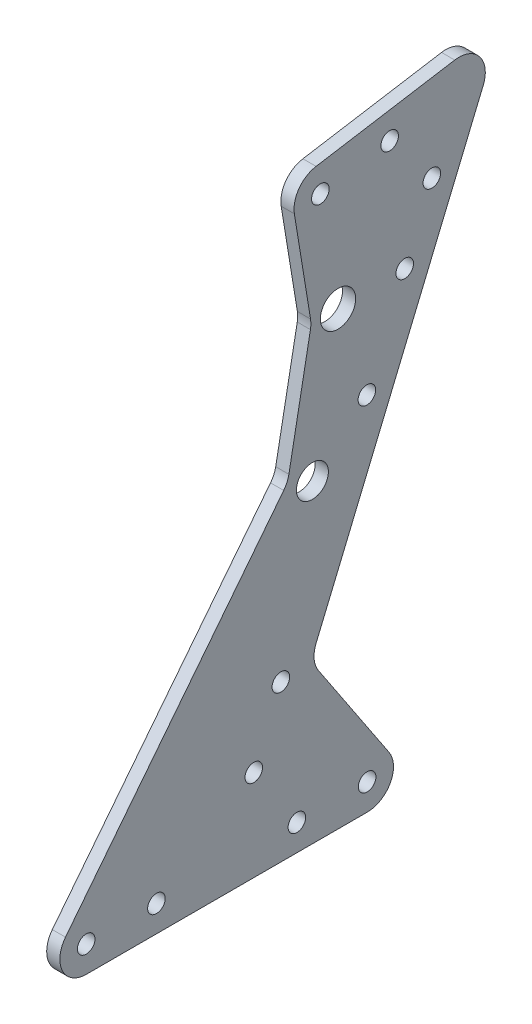
ISO-10303-21;
HEADER;
FILE_DESCRIPTION(('STEP AP214'),'2;1');
FILE_NAME('part.step','',(''),(''),'','','');
FILE_SCHEMA(('AUTOMOTIVE_DESIGN { 1 0 10303 214 1 1 1 1 }'));
ENDSEC;
DATA;
#1=APPLICATION_CONTEXT('core data for automotive mechanical design processes');
#2=APPLICATION_PROTOCOL_DEFINITION('international standard','automotive_design',2000,#1);
#3=PRODUCT_CONTEXT('',#1,'mechanical');
#4=PRODUCT('Part','Part','',(#3));
#5=PRODUCT_RELATED_PRODUCT_CATEGORY('part','',(#4));
#6=PRODUCT_DEFINITION_FORMATION('','',#4);
#7=PRODUCT_DEFINITION_CONTEXT('part definition',#1,'design');
#8=PRODUCT_DEFINITION('design','',#6,#7);
#9=PRODUCT_DEFINITION_SHAPE('','',#8);
#10=(LENGTH_UNIT() NAMED_UNIT(*) SI_UNIT(.MILLI.,.METRE.));
#11=(NAMED_UNIT(*) PLANE_ANGLE_UNIT() SI_UNIT($,.RADIAN.));
#12=(NAMED_UNIT(*) SI_UNIT($,.STERADIAN.) SOLID_ANGLE_UNIT());
#13=UNCERTAINTY_MEASURE_WITH_UNIT(LENGTH_MEASURE(1.E-05),#10,'distance_accuracy_value','');
#14=(GEOMETRIC_REPRESENTATION_CONTEXT(3) GLOBAL_UNCERTAINTY_ASSIGNED_CONTEXT((#13)) GLOBAL_UNIT_ASSIGNED_CONTEXT((#10,
#11,#12)) REPRESENTATION_CONTEXT('',''));
#15=CARTESIAN_POINT('',(0.,0.,0.));
#16=DIRECTION('',(0.,0.,1.));
#17=DIRECTION('',(1.,0.,0.));
#18=AXIS2_PLACEMENT_3D('',#15,#16,#17);
#19=CARTESIAN_POINT('',(17.2911124839999,-177.260133620989,1087.00573800224));
#20=DIRECTION('',(0.,-0.16094600503696,0.986963212821351));
#21=DIRECTION('',(0.,-0.986963212821351,-0.16094600503696));
#22=AXIS2_PLACEMENT_3D('',#19,#20,#21);
#23=PLANE('',#22);
#24=DIRECTION('',(0.,0.986963212821351,0.16094600503696));
#25=VECTOR('',#24,1.);
#26=CARTESIAN_POINT('',(12.5286124839999,-177.260133620989,1087.00573800224));
#27=LINE('',#26,#25);
#28=CARTESIAN_POINT('',(12.5286124839999,300.073552702172,1164.84546787795));
#29=VERTEX_POINT('',#28);
#30=CARTESIAN_POINT('',(12.5286124839999,335.947293432134,1170.69546834526));
#31=VERTEX_POINT('',#30);
#32=EDGE_CURVE('E229',#29,#31,#27,.T.);
#33=ORIENTED_EDGE('',*,*,#32,.F.);
#34=DIRECTION('',(-1.,0.,0.));
#35=VECTOR('',#34,1.);
#36=CARTESIAN_POINT('',(17.2911124839999,300.073552702172,1164.84546787795));
#37=LINE('',#36,#35);
#38=CARTESIAN_POINT('',(17.2911124839999,300.073552702172,1164.84546787795));
#39=VERTEX_POINT('',#38);
#40=EDGE_CURVE('E316',#29,#39,#37,.F.);
#41=ORIENTED_EDGE('',*,*,#40,.T.);
#42=DIRECTION('',(0.,0.986963212821351,0.16094600503696));
#43=VECTOR('',#42,1.);
#44=CARTESIAN_POINT('',(17.2911124839999,-177.260133620989,1087.00573800224));
#45=LINE('',#44,#43);
#46=CARTESIAN_POINT('',(17.2911124839999,335.947293432134,1170.69546834526));
#47=VERTEX_POINT('',#46);
#48=EDGE_CURVE('E172',#39,#47,#45,.T.);
#49=ORIENTED_EDGE('',*,*,#48,.T.);
#50=DIRECTION('',(-1.,0.,0.));
#51=VECTOR('',#50,1.);
#52=CARTESIAN_POINT('',(17.2911124839999,335.947293432134,1170.69546834526));
#53=LINE('',#52,#51);
#54=EDGE_CURVE('E228',#47,#31,#53,.T.);
#55=ORIENTED_EDGE('',*,*,#54,.T.);
#56=EDGE_LOOP('',(#33,#41,#49,#55));
#57=FACE_BOUND('',#56,.T.);
#58=ADVANCED_FACE('F41',(#57),#23,.T.);
#59=CARTESIAN_POINT('',(17.2911124839999,221.756612247857,1178.99650572783));
#60=DIRECTION('',(0.,-0.184847968546176,-0.982767128329164));
#61=DIRECTION('',(0.,0.982767128329164,-0.184847968546176));
#62=AXIS2_PLACEMENT_3D('',#59,#60,#61);
#63=PLANE('',#62);
#64=DIRECTION('',(0.,-0.982767128329164,0.184847968546176));
#65=VECTOR('',#64,1.);
#66=CARTESIAN_POINT('',(12.5286124839999,221.756612247857,1178.99650572783));
#67=LINE('',#66,#65);
#68=CARTESIAN_POINT('',(12.5286124839999,296.779865103792,1164.88543558274));
#69=VERTEX_POINT('',#68);
#70=CARTESIAN_POINT('',(12.5286124839999,255.363662032225,1172.67537969258));
#71=VERTEX_POINT('',#70);
#72=EDGE_CURVE('E231',#69,#71,#67,.T.);
#73=ORIENTED_EDGE('',*,*,#72,.T.);
#74=DIRECTION('',(-1.,0.,0.));
#75=VECTOR('',#74,1.);
#76=CARTESIAN_POINT('',(17.2911124839999,255.363662032225,1172.67537969258));
#77=LINE('',#76,#75);
#78=CARTESIAN_POINT('',(17.2911124839999,255.363662032225,1172.67537969258));
#79=VERTEX_POINT('',#78);
#80=EDGE_CURVE('E314',#71,#79,#77,.F.);
#81=ORIENTED_EDGE('',*,*,#80,.T.);
#82=DIRECTION('',(0.,-0.982767128329164,0.184847968546176));
#83=VECTOR('',#82,1.);
#84=CARTESIAN_POINT('',(17.2911124839999,221.756612247857,1178.99650572783));
#85=LINE('',#84,#83);
#86=CARTESIAN_POINT('',(17.2911124839999,296.779865103792,1164.88543558274));
#87=VERTEX_POINT('',#86);
#88=EDGE_CURVE('E170',#87,#79,#85,.T.);
#89=ORIENTED_EDGE('',*,*,#88,.F.);
#90=DIRECTION('',(-1.,0.,0.));
#91=VECTOR('',#90,1.);
#92=CARTESIAN_POINT('',(17.2911124839999,296.779865103792,1164.88543558274));
#93=LINE('',#92,#91);
#94=EDGE_CURVE('E311',#87,#69,#93,.T.);
#95=ORIENTED_EDGE('',*,*,#94,.T.);
#96=EDGE_LOOP('',(#73,#81,#89,#95));
#97=FACE_BOUND('',#96,.T.);
#98=ADVANCED_FACE('F344',(#97),#63,.F.);
#99=CARTESIAN_POINT('',(17.2911124839999,666.473775740038,848.323474721654));
#100=DIRECTION('',(0.,0.617783669154316,0.786348102386106));
#101=DIRECTION('',(0.,-0.786348102386106,0.617783669154316));
#102=AXIS2_PLACEMENT_3D('',#99,#100,#101);
#103=PLANE('',#102);
#104=DIRECTION('',(0.,0.786348102386106,-0.617783669154316));
#105=VECTOR('',#104,1.);
#106=CARTESIAN_POINT('',(17.2911124839999,666.473775740038,848.323474721654));
#107=LINE('',#106,#105);
#108=CARTESIAN_POINT('',(17.2911124839999,150.788964002695,1253.46421856721));
#109=VERTEX_POINT('',#108);
#110=CARTESIAN_POINT('',(17.2911124839999,251.239949483933,1174.54627091469));
#111=VERTEX_POINT('',#110);
#112=EDGE_CURVE('E149',#109,#111,#107,.T.);
#113=ORIENTED_EDGE('',*,*,#112,.T.);
#114=DIRECTION('',(-1.,0.,0.));
#115=VECTOR('',#114,1.);
#116=CARTESIAN_POINT('',(17.2911124839999,251.239949483932,1174.54627091469));
#117=LINE('',#116,#115);
#118=CARTESIAN_POINT('',(12.5286124839999,251.239949483933,1174.54627091469));
#119=VERTEX_POINT('',#118);
#120=EDGE_CURVE('E309',#111,#119,#117,.T.);
#121=ORIENTED_EDGE('',*,*,#120,.T.);
#122=DIRECTION('',(0.,0.786348102386106,-0.617783669154316));
#123=VECTOR('',#122,1.);
#124=CARTESIAN_POINT('',(12.5286124839999,666.473775740038,848.323474721654));
#125=LINE('',#124,#123);
#126=CARTESIAN_POINT('',(12.5286124839999,150.788964002695,1253.46421856721));
#127=VERTEX_POINT('',#126);
#128=EDGE_CURVE('E152',#127,#119,#125,.T.);
#129=ORIENTED_EDGE('',*,*,#128,.F.);
#130=DIRECTION('',(-1.,0.,0.));
#131=VECTOR('',#130,1.);
#132=CARTESIAN_POINT('',(17.2911124839999,150.788964002695,1253.46421856721));
#133=LINE('',#132,#131);
#134=EDGE_CURVE('E144',#109,#127,#133,.T.);
#135=ORIENTED_EDGE('',*,*,#134,.F.);
#136=EDGE_LOOP('',(#113,#121,#129,#135));
#137=FACE_BOUND('',#136,.T.);
#138=ADVANCED_FACE('F146',(#137),#103,.T.);
#139=CARTESIAN_POINT('',(17.2911124839999,144.904574554,1245.97425289198));
#140=DIRECTION('',(-1.,0.,0.));
#141=DIRECTION('',(0.,0.,1.));
#142=AXIS2_PLACEMENT_3D('',#139,#140,#141);
#143=CYLINDRICAL_SURFACE('',#142,9.52499999999998);
#144=CARTESIAN_POINT('',(12.5286124839999,144.904574554,1245.97425289198));
#145=DIRECTION('',(1.,0.,0.));
#146=DIRECTION('',(0.,0.,-1.));
#147=AXIS2_PLACEMENT_3D('',#144,#145,#146);
#148=CIRCLE('',#147,9.52499999999998);
#149=CARTESIAN_POINT('',(12.5286124839999,135.379574554,1245.97425289198));
#150=VERTEX_POINT('',#149);
#151=EDGE_CURVE('E235',#127,#150,#148,.T.);
#152=ORIENTED_EDGE('',*,*,#151,.T.);
#153=DIRECTION('',(-1.,0.,0.));
#154=VECTOR('',#153,1.);
#155=CARTESIAN_POINT('',(17.2911124839999,135.379574554,1245.97425289198));
#156=LINE('',#155,#154);
#157=CARTESIAN_POINT('',(17.2911124839999,135.379574554,1245.97425289198));
#158=VERTEX_POINT('',#157);
#159=EDGE_CURVE('E156',#158,#150,#156,.T.);
#160=ORIENTED_EDGE('',*,*,#159,.F.);
#161=CARTESIAN_POINT('',(17.2911124839999,144.904574554,1245.97425289198));
#162=DIRECTION('',(1.,0.,0.));
#163=DIRECTION('',(0.,0.,-1.));
#164=AXIS2_PLACEMENT_3D('',#161,#162,#163);
#165=CIRCLE('',#164,9.52499999999998);
#166=EDGE_CURVE('E159',#109,#158,#165,.T.);
#167=ORIENTED_EDGE('',*,*,#166,.F.);
#168=ORIENTED_EDGE('',*,*,#134,.T.);
#169=EDGE_LOOP('',(#152,#160,#167,#168));
#170=FACE_BOUND('',#169,.T.);
#171=ADVANCED_FACE('F160',(#170),#143,.T.);
#172=CARTESIAN_POINT('',(17.2911124839999,135.379574554001,0.));
#173=DIRECTION('',(0.,1.,0.));
#174=DIRECTION('',(0.,0.,1.));
#175=AXIS2_PLACEMENT_3D('',#172,#173,#174);
#176=PLANE('',#175);
#177=DIRECTION('',(0.,0.,-1.));
#178=VECTOR('',#177,1.);
#179=CARTESIAN_POINT('',(12.5286124839999,135.379574554001,0.));
#180=LINE('',#179,#178);
#181=CARTESIAN_POINT('',(12.5286124839999,135.379574554,1144.37425289198));
#182=VERTEX_POINT('',#181);
#183=EDGE_CURVE('E237',#150,#182,#180,.T.);
#184=ORIENTED_EDGE('',*,*,#183,.T.);
#185=DIRECTION('',(-1.,0.,0.));
#186=VECTOR('',#185,1.);
#187=CARTESIAN_POINT('',(17.2911124839999,135.379574554,1144.37425289198));
#188=LINE('',#187,#186);
#189=CARTESIAN_POINT('',(17.2911124839999,135.379574554,1144.37425289198));
#190=VERTEX_POINT('',#189);
#191=EDGE_CURVE('E299',#190,#182,#188,.T.);
#192=ORIENTED_EDGE('',*,*,#191,.F.);
#193=DIRECTION('',(0.,0.,-1.));
#194=VECTOR('',#193,1.);
#195=CARTESIAN_POINT('',(17.2911124839999,135.379574554001,0.));
#196=LINE('',#195,#194);
#197=EDGE_CURVE('E163',#158,#190,#196,.T.);
#198=ORIENTED_EDGE('',*,*,#197,.F.);
#199=ORIENTED_EDGE('',*,*,#159,.T.);
#200=EDGE_LOOP('',(#184,#192,#198,#199));
#201=FACE_BOUND('',#200,.T.);
#202=ADVANCED_FACE('F351',(#201),#176,.F.);
#203=CARTESIAN_POINT('',(17.2911124839999,144.904574554,1144.37425289198));
#204=DIRECTION('',(-1.,0.,0.));
#205=DIRECTION('',(0.,0.,1.));
#206=AXIS2_PLACEMENT_3D('',#203,#204,#205);
#207=CYLINDRICAL_SURFACE('',#206,9.52500000000001);
#208=CARTESIAN_POINT('',(12.5286124839999,144.904574554,1144.37425289198));
#209=DIRECTION('',(1.,0.,0.));
#210=DIRECTION('',(0.,0.,-1.));
#211=AXIS2_PLACEMENT_3D('',#208,#209,#210);
#212=CIRCLE('',#211,9.52500000000001);
#213=CARTESIAN_POINT('',(12.5286124839999,150.182469724752,1136.44522725408));
#214=VERTEX_POINT('',#213);
#215=EDGE_CURVE('E239',#182,#214,#212,.T.);
#216=ORIENTED_EDGE('',*,*,#215,.T.);
#217=DIRECTION('',(-1.,0.,0.));
#218=VECTOR('',#217,1.);
#219=CARTESIAN_POINT('',(17.2911124839999,150.182469724752,1136.44522725408));
#220=LINE('',#219,#218);
#221=CARTESIAN_POINT('',(17.2911124839999,150.182469724752,1136.44522725408));
#222=VERTEX_POINT('',#221);
#223=EDGE_CURVE('E296',#222,#214,#220,.T.);
#224=ORIENTED_EDGE('',*,*,#223,.F.);
#225=CARTESIAN_POINT('',(17.2911124839999,144.904574554,1144.37425289198));
#226=DIRECTION('',(1.,0.,0.));
#227=DIRECTION('',(0.,0.,-1.));
#228=AXIS2_PLACEMENT_3D('',#225,#226,#227);
#229=CIRCLE('',#228,9.52500000000001);
#230=EDGE_CURVE('E177',#190,#222,#229,.T.);
#231=ORIENTED_EDGE('',*,*,#230,.F.);
#232=ORIENTED_EDGE('',*,*,#191,.T.);
#233=EDGE_LOOP('',(#216,#224,#231,#232));
#234=FACE_BOUND('',#233,.T.);
#235=ADVANCED_FACE('F358',(#234),#207,.T.);
#236=CARTESIAN_POINT('',(17.2911124839999,-478.090878006488,718.239886606647));
#237=DIRECTION('',(0.,-0.554109729212728,0.832443636525499));
#238=DIRECTION('',(0.,-0.832443636525499,-0.554109729212728));
#239=AXIS2_PLACEMENT_3D('',#236,#237,#238);
#240=PLANE('',#239);
#241=DIRECTION('',(0.,0.832443636525499,0.554109729212728));
#242=VECTOR('',#241,1.);
#243=CARTESIAN_POINT('',(12.5286124839999,-478.090878006488,718.239886606647));
#244=LINE('',#243,#242);
#245=CARTESIAN_POINT('',(12.5286124839999,188.552796057086,1161.98614101799));
#246=VERTEX_POINT('',#245);
#247=EDGE_CURVE('E241',#214,#246,#244,.T.);
#248=ORIENTED_EDGE('',*,*,#247,.T.);
#249=DIRECTION('',(-1.,0.,0.));
#250=VECTOR('',#249,1.);
#251=CARTESIAN_POINT('',(17.2911124839999,188.552796057086,1161.98614101799));
#252=LINE('',#251,#250);
#253=CARTESIAN_POINT('',(17.2911124839999,188.552796057086,1161.98614101799));
#254=VERTEX_POINT('',#253);
#255=EDGE_CURVE('E307',#246,#254,#252,.F.);
#256=ORIENTED_EDGE('',*,*,#255,.T.);
#257=DIRECTION('',(0.,0.832443636525499,0.554109729212728));
#258=VECTOR('',#257,1.);
#259=CARTESIAN_POINT('',(17.2911124839999,-478.090878006488,718.239886606647));
#260=LINE('',#259,#258);
#261=EDGE_CURVE('E179',#222,#254,#260,.T.);
#262=ORIENTED_EDGE('',*,*,#261,.F.);
#263=ORIENTED_EDGE('',*,*,#223,.T.);
#264=EDGE_LOOP('',(#248,#256,#262,#263));
#265=FACE_BOUND('',#264,.T.);
#266=ADVANCED_FACE('F361',(#265),#240,.F.);
#267=CARTESIAN_POINT('',(17.2911124839999,443.420534507392,1059.97031914496));
#268=DIRECTION('',(0.,0.385924815983594,0.922530236040006));
#269=DIRECTION('',(0.,-0.922530236040006,0.385924815983594));
#270=AXIS2_PLACEMENT_3D('',#267,#268,#269);
#271=PLANE('',#270);
#272=DIRECTION('',(0.,0.922530236040006,-0.385924815983594));
#273=VECTOR('',#272,1.);
#274=CARTESIAN_POINT('',(17.2911124839999,443.420534507392,1059.97031914496));
#275=LINE('',#274,#273);
#276=CARTESIAN_POINT('',(17.2911124839999,197.506625100081,1162.84421587836));
#277=VERTEX_POINT('',#276);
#278=CARTESIAN_POINT('',(17.2911124839999,342.042705737599,1102.38000761299));
#279=VERTEX_POINT('',#278);
#280=EDGE_CURVE('E182',#277,#279,#275,.T.);
#281=ORIENTED_EDGE('',*,*,#280,.F.);
#282=DIRECTION('',(-1.,0.,0.));
#283=VECTOR('',#282,1.);
#284=CARTESIAN_POINT('',(12.5286124839999,197.506625100081,1162.84421587836));
#285=LINE('',#284,#283);
#286=CARTESIAN_POINT('',(12.5286124839999,197.506625100081,1162.84421587836));
#287=VERTEX_POINT('',#286);
#288=EDGE_CURVE('E304',#277,#287,#285,.T.);
#289=ORIENTED_EDGE('',*,*,#288,.T.);
#290=DIRECTION('',(0.,0.922530236040006,-0.385924815983594));
#291=VECTOR('',#290,1.);
#292=CARTESIAN_POINT('',(12.5286124839999,443.420534507392,1059.97031914496));
#293=LINE('',#292,#291);
#294=CARTESIAN_POINT('',(12.5286124839999,342.042705737599,1102.38000761299));
#295=VERTEX_POINT('',#294);
#296=EDGE_CURVE('E244',#287,#295,#293,.T.);
#297=ORIENTED_EDGE('',*,*,#296,.T.);
#298=DIRECTION('',(-1.,0.,0.));
#299=VECTOR('',#298,1.);
#300=CARTESIAN_POINT('',(17.2911124839999,342.042705737599,1102.38000761299));
#301=LINE('',#300,#299);
#302=EDGE_CURVE('E155',#295,#279,#301,.F.);
#303=ORIENTED_EDGE('',*,*,#302,.T.);
#304=EDGE_LOOP('',(#281,#289,#297,#303));
#305=FACE_BOUND('',#304,.T.);
#306=ADVANCED_FACE('F368',(#305),#271,.F.);
#307=CARTESIAN_POINT('',(17.2911124839999,523.83998949641,86.0917959914146));
#308=DIRECTION('',(0.,0.986762512438189,0.162171958262431));
#309=DIRECTION('',(0.,-0.162171958262431,0.98676251243819));
#310=AXIS2_PLACEMENT_3D('',#307,#308,#309);
#311=PLANE('',#310);
#312=DIRECTION('',(0.,0.162171958262432,-0.98676251243819));
#313=VECTOR('',#312,1.);
#314=CARTESIAN_POINT('',(17.2911124839999,523.83998949641,86.0917959914146));
#315=LINE('',#314,#313);
#316=CARTESIAN_POINT('',(17.2911124839999,346.879217061085,1162.83933164558));
#317=VERTEX_POINT('',#316);
#318=CARTESIAN_POINT('',(17.2911124839999,355.117552540817,1112.71179601372));
#319=VERTEX_POINT('',#318);
#320=EDGE_CURVE('E184',#317,#319,#315,.T.);
#321=ORIENTED_EDGE('',*,*,#320,.T.);
#322=DIRECTION('',(-1.,0.,0.));
#323=VECTOR('',#322,1.);
#324=CARTESIAN_POINT('',(12.5286124839999,355.117552540817,1112.71179601372));
#325=LINE('',#324,#323);
#326=CARTESIAN_POINT('',(12.5286124839999,355.117552540817,1112.71179601372));
#327=VERTEX_POINT('',#326);
#328=EDGE_CURVE('E318',#319,#327,#325,.T.);
#329=ORIENTED_EDGE('',*,*,#328,.T.);
#330=DIRECTION('',(0.,0.162171958262432,-0.98676251243819));
#331=VECTOR('',#330,1.);
#332=CARTESIAN_POINT('',(12.5286124839999,523.83998949641,86.0917959914146));
#333=LINE('',#332,#331);
#334=CARTESIAN_POINT('',(12.5286124839999,346.879217061085,1162.83933164558));
#335=VERTEX_POINT('',#334);
#336=EDGE_CURVE('E247',#335,#327,#333,.T.);
#337=ORIENTED_EDGE('',*,*,#336,.F.);
#338=DIRECTION('',(-1.,0.,0.));
#339=VECTOR('',#338,1.);
#340=CARTESIAN_POINT('',(17.2911124839999,346.879217061085,1162.83933164558));
#341=LINE('',#340,#339);
#342=EDGE_CURVE('E294',#317,#335,#341,.T.);
#343=ORIENTED_EDGE('',*,*,#342,.F.);
#344=EDGE_LOOP('',(#321,#329,#337,#343));
#345=FACE_BOUND('',#344,.T.);
#346=ADVANCED_FACE('F372',(#345),#311,.T.);
#347=CARTESIAN_POINT('',(17.2911124839999,298.305859312676,1154.90639105955));
#348=DIRECTION('',(-1.,0.,0.));
#349=DIRECTION('',(0.,0.,1.));
#350=AXIS2_PLACEMENT_3D('',#347,#348,#349);
#351=CYLINDRICAL_SURFACE('',#350,6.38209851418466);
#352=CARTESIAN_POINT('',(17.2911124839999,298.305859312676,1154.90639105955));
#353=DIRECTION('',(1.,0.,0.));
#354=DIRECTION('',(0.,0.,-1.));
#355=AXIS2_PLACEMENT_3D('',#352,#353,#354);
#356=CIRCLE('',#355,6.38209851418466);
#357=CARTESIAN_POINT('',(17.2911124839999,298.305859312676,1148.52429254536));
#358=VERTEX_POINT('',#357);
#359=EDGE_CURVE('E222',#358,#358,#356,.T.);
#360=ORIENTED_EDGE('',*,*,#359,.T.);
#361=EDGE_LOOP('',(#360));
#362=FACE_BOUND('',#361,.T.);
#363=CARTESIAN_POINT('',(12.5286124839999,298.305859312676,1154.90639105955));
#364=DIRECTION('',(1.,0.,0.));
#365=DIRECTION('',(0.,0.,-1.));
#366=AXIS2_PLACEMENT_3D('',#363,#364,#365);
#367=CIRCLE('',#366,6.38209851418466);
#368=CARTESIAN_POINT('',(12.5286124839999,298.305859312676,1148.52429254536));
#369=VERTEX_POINT('',#368);
#370=EDGE_CURVE('E286',#369,#369,#367,.T.);
#371=ORIENTED_EDGE('',*,*,#370,.F.);
#372=EDGE_LOOP('',(#371));
#373=FACE_BOUND('',#372,.T.);
#374=ADVANCED_FACE('F556',(#362,#373),#351,.F.);
#375=CARTESIAN_POINT('',(17.2911124839999,322.286371614427,1120.96959843726));
#376=DIRECTION('',(-1.,0.,0.));
#377=DIRECTION('',(0.,0.,1.));
#378=AXIS2_PLACEMENT_3D('',#375,#376,#377);
#379=CYLINDRICAL_SURFACE('',#378,3.17500000000009);
#380=CARTESIAN_POINT('',(17.2911124839999,322.286371614427,1120.96959843726));
#381=DIRECTION('',(1.,0.,0.));
#382=DIRECTION('',(0.,0.,-1.));
#383=AXIS2_PLACEMENT_3D('',#380,#381,#382);
#384=CIRCLE('',#383,3.17500000000009);
#385=CARTESIAN_POINT('',(17.2911124839999,322.286371614427,1117.79459843726));
#386=VERTEX_POINT('',#385);
#387=EDGE_CURVE('E219',#386,#386,#384,.T.);
#388=ORIENTED_EDGE('',*,*,#387,.T.);
#389=EDGE_LOOP('',(#388));
#390=FACE_BOUND('',#389,.T.);
#391=CARTESIAN_POINT('',(12.5286124839999,322.286371614427,1120.96959843726));
#392=DIRECTION('',(1.,0.,0.));
#393=DIRECTION('',(0.,0.,-1.));
#394=AXIS2_PLACEMENT_3D('',#391,#392,#393);
#395=CIRCLE('',#394,3.17500000000009);
#396=CARTESIAN_POINT('',(12.5286124839999,322.286371614427,1117.79459843726));
#397=VERTEX_POINT('',#396);
#398=EDGE_CURVE('E283',#397,#397,#395,.T.);
#399=ORIENTED_EDGE('',*,*,#398,.F.);
#400=EDGE_LOOP('',(#399));
#401=FACE_BOUND('',#400,.T.);
#402=ADVANCED_FACE('F546',(#390,#401),#379,.F.);
#403=CARTESIAN_POINT('',(17.2911124839999,298.854103619011,1130.77208876324));
#404=DIRECTION('',(-1.,0.,0.));
#405=DIRECTION('',(0.,0.,1.));
#406=AXIS2_PLACEMENT_3D('',#403,#404,#405);
#407=CYLINDRICAL_SURFACE('',#406,3.17500000000009);
#408=CARTESIAN_POINT('',(17.2911124839999,298.854103619011,1130.77208876324));
#409=DIRECTION('',(1.,0.,0.));
#410=DIRECTION('',(0.,0.,-1.));
#411=AXIS2_PLACEMENT_3D('',#408,#409,#410);
#412=CIRCLE('',#411,3.17500000000009);
#413=CARTESIAN_POINT('',(17.2911124839999,298.854103619011,1127.59708876324));
#414=VERTEX_POINT('',#413);
#415=EDGE_CURVE('E216',#414,#414,#412,.T.);
#416=ORIENTED_EDGE('',*,*,#415,.T.);
#417=EDGE_LOOP('',(#416));
#418=FACE_BOUND('',#417,.T.);
#419=CARTESIAN_POINT('',(12.5286124839999,298.854103619011,1130.77208876324));
#420=DIRECTION('',(1.,0.,0.));
#421=DIRECTION('',(0.,0.,-1.));
#422=AXIS2_PLACEMENT_3D('',#419,#420,#421);
#423=CIRCLE('',#422,3.17500000000009);
#424=CARTESIAN_POINT('',(12.5286124839999,298.854103619011,1127.59708876324));
#425=VERTEX_POINT('',#424);
#426=EDGE_CURVE('E280',#425,#425,#423,.T.);
#427=ORIENTED_EDGE('',*,*,#426,.F.);
#428=EDGE_LOOP('',(#427));
#429=FACE_BOUND('',#428,.T.);
#430=ADVANCED_FACE('F536',(#418,#429),#407,.F.);
#431=CARTESIAN_POINT('',(17.2911124839999,341.599471869977,1136.2308759272));
#432=DIRECTION('',(-1.,0.,0.));
#433=DIRECTION('',(0.,0.,1.));
#434=AXIS2_PLACEMENT_3D('',#431,#432,#433);
#435=CYLINDRICAL_SURFACE('',#434,3.17500000000009);
#436=CARTESIAN_POINT('',(17.2911124839999,341.599471869977,1136.2308759272));
#437=DIRECTION('',(1.,0.,0.));
#438=DIRECTION('',(0.,0.,-1.));
#439=AXIS2_PLACEMENT_3D('',#436,#437,#438);
#440=CIRCLE('',#439,3.17500000000009);
#441=CARTESIAN_POINT('',(17.2911124839999,341.599471869977,1133.0558759272));
#442=VERTEX_POINT('',#441);
#443=EDGE_CURVE('E213',#442,#442,#440,.T.);
#444=ORIENTED_EDGE('',*,*,#443,.T.);
#445=EDGE_LOOP('',(#444));
#446=FACE_BOUND('',#445,.T.);
#447=CARTESIAN_POINT('',(12.5286124839999,341.599471869977,1136.2308759272));
#448=DIRECTION('',(1.,0.,0.));
#449=DIRECTION('',(0.,0.,-1.));
#450=AXIS2_PLACEMENT_3D('',#447,#448,#449);
#451=CIRCLE('',#450,3.17500000000009);
#452=CARTESIAN_POINT('',(12.5286124839999,341.599471869977,1133.0558759272));
#453=VERTEX_POINT('',#452);
#454=EDGE_CURVE('E277',#453,#453,#451,.T.);
#455=ORIENTED_EDGE('',*,*,#454,.F.);
#456=EDGE_LOOP('',(#455));
#457=FACE_BOUND('',#456,.T.);
#458=ADVANCED_FACE('F526',(#446,#457),#435,.F.);
#459=CARTESIAN_POINT('',(17.2911124839999,337.480304130111,1161.29464374313));
#460=DIRECTION('',(-1.,0.,0.));
#461=DIRECTION('',(0.,0.,1.));
#462=AXIS2_PLACEMENT_3D('',#459,#460,#461);
#463=CYLINDRICAL_SURFACE('',#462,3.17500000000009);
#464=CARTESIAN_POINT('',(17.2911124839999,337.480304130111,1161.29464374313));
#465=DIRECTION('',(1.,0.,0.));
#466=DIRECTION('',(0.,0.,-1.));
#467=AXIS2_PLACEMENT_3D('',#464,#465,#466);
#468=CIRCLE('',#467,3.17500000000009);
#469=CARTESIAN_POINT('',(17.2911124839999,337.480304130111,1158.11964374313));
#470=VERTEX_POINT('',#469);
#471=EDGE_CURVE('E210',#470,#470,#468,.T.);
#472=ORIENTED_EDGE('',*,*,#471,.T.);
#473=EDGE_LOOP('',(#472));
#474=FACE_BOUND('',#473,.T.);
#475=CARTESIAN_POINT('',(12.5286124839999,337.480304130111,1161.29464374313));
#476=DIRECTION('',(1.,0.,0.));
#477=DIRECTION('',(0.,0.,-1.));
#478=AXIS2_PLACEMENT_3D('',#475,#476,#477);
#479=CIRCLE('',#478,3.17500000000009);
#480=CARTESIAN_POINT('',(12.5286124839999,337.480304130111,1158.11964374313));
#481=VERTEX_POINT('',#480);
#482=EDGE_CURVE('E274',#481,#481,#479,.T.);
#483=ORIENTED_EDGE('',*,*,#482,.F.);
#484=EDGE_LOOP('',(#483));
#485=FACE_BOUND('',#484,.T.);
#486=ADVANCED_FACE('F516',(#474,#485),#463,.F.);
#487=CARTESIAN_POINT('',(17.2911124839999,144.904574554,1245.97425289198));
#488=DIRECTION('',(-1.,0.,0.));
#489=DIRECTION('',(0.,0.,1.));
#490=AXIS2_PLACEMENT_3D('',#487,#488,#489);
#491=CYLINDRICAL_SURFACE('',#490,3.17500000000009);
#492=CARTESIAN_POINT('',(17.2911124839999,144.904574554,1245.97425289198));
#493=DIRECTION('',(1.,0.,0.));
#494=DIRECTION('',(0.,0.,-1.));
#495=AXIS2_PLACEMENT_3D('',#492,#493,#494);
#496=CIRCLE('',#495,3.17500000000009);
#497=CARTESIAN_POINT('',(17.2911124839999,144.904574554,1242.79925289198));
#498=VERTEX_POINT('',#497);
#499=EDGE_CURVE('E207',#498,#498,#496,.T.);
#500=ORIENTED_EDGE('',*,*,#499,.T.);
#501=EDGE_LOOP('',(#500));
#502=FACE_BOUND('',#501,.T.);
#503=CARTESIAN_POINT('',(12.5286124839999,144.904574554,1245.97425289198));
#504=DIRECTION('',(1.,0.,0.));
#505=DIRECTION('',(0.,0.,-1.));
#506=AXIS2_PLACEMENT_3D('',#503,#504,#505);
#507=CIRCLE('',#506,3.17500000000009);
#508=CARTESIAN_POINT('',(12.5286124839999,144.904574554,1242.79925289198));
#509=VERTEX_POINT('',#508);
#510=EDGE_CURVE('E271',#509,#509,#507,.T.);
#511=ORIENTED_EDGE('',*,*,#510,.F.);
#512=EDGE_LOOP('',(#511));
#513=FACE_BOUND('',#512,.T.);
#514=ADVANCED_FACE('F506',(#502,#513),#491,.F.);
#515=CARTESIAN_POINT('',(17.2911124839999,144.904574554,1220.57425289198));
#516=DIRECTION('',(-1.,0.,0.));
#517=DIRECTION('',(0.,0.,1.));
#518=AXIS2_PLACEMENT_3D('',#515,#516,#517);
#519=CYLINDRICAL_SURFACE('',#518,3.17500000000009);
#520=CARTESIAN_POINT('',(17.2911124839999,144.904574554,1220.57425289198));
#521=DIRECTION('',(1.,0.,0.));
#522=DIRECTION('',(0.,0.,-1.));
#523=AXIS2_PLACEMENT_3D('',#520,#521,#522);
#524=CIRCLE('',#523,3.17500000000009);
#525=CARTESIAN_POINT('',(17.2911124839999,144.904574554,1217.39925289198));
#526=VERTEX_POINT('',#525);
#527=EDGE_CURVE('E204',#526,#526,#524,.T.);
#528=ORIENTED_EDGE('',*,*,#527,.T.);
#529=EDGE_LOOP('',(#528));
#530=FACE_BOUND('',#529,.T.);
#531=CARTESIAN_POINT('',(12.5286124839999,144.904574554,1220.57425289198));
#532=DIRECTION('',(1.,0.,0.));
#533=DIRECTION('',(0.,0.,-1.));
#534=AXIS2_PLACEMENT_3D('',#531,#532,#533);
#535=CIRCLE('',#534,3.17500000000009);
#536=CARTESIAN_POINT('',(12.5286124839999,144.904574554,1217.39925289198));
#537=VERTEX_POINT('',#536);
#538=EDGE_CURVE('E268',#537,#537,#535,.T.);
#539=ORIENTED_EDGE('',*,*,#538,.F.);
#540=EDGE_LOOP('',(#539));
#541=FACE_BOUND('',#540,.T.);
#542=ADVANCED_FACE('F496',(#530,#541),#519,.F.);
#543=CARTESIAN_POINT('',(17.2911124839999,168.336842549416,1185.371762566));
#544=DIRECTION('',(-1.,0.,0.));
#545=DIRECTION('',(0.,0.,1.));
#546=AXIS2_PLACEMENT_3D('',#543,#544,#545);
#547=CYLINDRICAL_SURFACE('',#546,3.17500000000009);
#548=CARTESIAN_POINT('',(17.2911124839999,168.336842549416,1185.371762566));
#549=DIRECTION('',(1.,0.,0.));
#550=DIRECTION('',(0.,0.,-1.));
#551=AXIS2_PLACEMENT_3D('',#548,#549,#550);
#552=CIRCLE('',#551,3.17500000000009);
#553=CARTESIAN_POINT('',(17.2911124839999,168.336842549416,1182.196762566));
#554=VERTEX_POINT('',#553);
#555=EDGE_CURVE('E201',#554,#554,#552,.T.);
#556=ORIENTED_EDGE('',*,*,#555,.T.);
#557=EDGE_LOOP('',(#556));
#558=FACE_BOUND('',#557,.T.);
#559=CARTESIAN_POINT('',(12.5286124839999,168.336842549416,1185.371762566));
#560=DIRECTION('',(1.,0.,0.));
#561=DIRECTION('',(0.,0.,-1.));
#562=AXIS2_PLACEMENT_3D('',#559,#560,#561);
#563=CIRCLE('',#562,3.17500000000009);
#564=CARTESIAN_POINT('',(12.5286124839999,168.336842549416,1182.196762566));
#565=VERTEX_POINT('',#564);
#566=EDGE_CURVE('E265',#565,#565,#563,.T.);
#567=ORIENTED_EDGE('',*,*,#566,.F.);
#568=EDGE_LOOP('',(#567));
#569=FACE_BOUND('',#568,.T.);
#570=ADVANCED_FACE('F486',(#558,#569),#547,.F.);
#571=CARTESIAN_POINT('',(17.2911124839999,144.904574554,1144.37425289198));
#572=DIRECTION('',(-1.,0.,0.));
#573=DIRECTION('',(0.,0.,1.));
#574=AXIS2_PLACEMENT_3D('',#571,#572,#573);
#575=CYLINDRICAL_SURFACE('',#574,3.17500000000009);
#576=CARTESIAN_POINT('',(17.2911124839999,144.904574554,1144.37425289198));
#577=DIRECTION('',(1.,0.,0.));
#578=DIRECTION('',(0.,0.,-1.));
#579=AXIS2_PLACEMENT_3D('',#576,#577,#578);
#580=CIRCLE('',#579,3.17500000000009);
#581=CARTESIAN_POINT('',(17.2911124839999,144.904574554,1141.19925289198));
#582=VERTEX_POINT('',#581);
#583=EDGE_CURVE('E198',#582,#582,#580,.T.);
#584=ORIENTED_EDGE('',*,*,#583,.T.);
#585=EDGE_LOOP('',(#584));
#586=FACE_BOUND('',#585,.T.);
#587=CARTESIAN_POINT('',(12.5286124839999,144.904574554,1144.37425289198));
#588=DIRECTION('',(1.,0.,0.));
#589=DIRECTION('',(0.,0.,-1.));
#590=AXIS2_PLACEMENT_3D('',#587,#588,#589);
#591=CIRCLE('',#590,3.17500000000009);
#592=CARTESIAN_POINT('',(12.5286124839999,144.904574554,1141.19925289198));
#593=VERTEX_POINT('',#592);
#594=EDGE_CURVE('E262',#593,#593,#591,.T.);
#595=ORIENTED_EDGE('',*,*,#594,.F.);
#596=EDGE_LOOP('',(#595));
#597=FACE_BOUND('',#596,.T.);
#598=ADVANCED_FACE('F476',(#586,#597),#575,.F.);
#599=CARTESIAN_POINT('',(17.2911124839999,144.904574554,1169.77425289198));
#600=DIRECTION('',(-1.,0.,0.));
#601=DIRECTION('',(0.,0.,1.));
#602=AXIS2_PLACEMENT_3D('',#599,#600,#601);
#603=CYLINDRICAL_SURFACE('',#602,3.17500000000009);
#604=CARTESIAN_POINT('',(17.2911124839999,144.904574554,1169.77425289198));
#605=DIRECTION('',(1.,0.,0.));
#606=DIRECTION('',(0.,0.,-1.));
#607=AXIS2_PLACEMENT_3D('',#604,#605,#606);
#608=CIRCLE('',#607,3.17500000000009);
#609=CARTESIAN_POINT('',(17.2911124839999,144.904574554,1166.59925289198));
#610=VERTEX_POINT('',#609);
#611=EDGE_CURVE('E195',#610,#610,#608,.T.);
#612=ORIENTED_EDGE('',*,*,#611,.T.);
#613=EDGE_LOOP('',(#612));
#614=FACE_BOUND('',#613,.T.);
#615=CARTESIAN_POINT('',(12.5286124839999,144.904574554,1169.77425289198));
#616=DIRECTION('',(1.,0.,0.));
#617=DIRECTION('',(0.,0.,-1.));
#618=AXIS2_PLACEMENT_3D('',#615,#616,#617);
#619=CIRCLE('',#618,3.17500000000009);
#620=CARTESIAN_POINT('',(12.5286124839999,144.904574554,1166.59925289198));
#621=VERTEX_POINT('',#620);
#622=EDGE_CURVE('E259',#621,#621,#619,.T.);
#623=ORIENTED_EDGE('',*,*,#622,.F.);
#624=EDGE_LOOP('',(#623));
#625=FACE_BOUND('',#624,.T.);
#626=ADVANCED_FACE('F466',(#614,#625),#603,.F.);
#627=CARTESIAN_POINT('',(17.2911124839999,191.769110544832,1175.56927224002));
#628=DIRECTION('',(-1.,0.,0.));
#629=DIRECTION('',(0.,0.,1.));
#630=AXIS2_PLACEMENT_3D('',#627,#628,#629);
#631=CYLINDRICAL_SURFACE('',#630,3.17500000000009);
#632=CARTESIAN_POINT('',(17.2911124839999,191.769110544832,1175.56927224002));
#633=DIRECTION('',(1.,0.,0.));
#634=DIRECTION('',(0.,0.,-1.));
#635=AXIS2_PLACEMENT_3D('',#632,#633,#634);
#636=CIRCLE('',#635,3.17500000000009);
#637=CARTESIAN_POINT('',(17.2911124839999,191.769110544832,1172.39427224002));
#638=VERTEX_POINT('',#637);
#639=EDGE_CURVE('E192',#638,#638,#636,.T.);
#640=ORIENTED_EDGE('',*,*,#639,.T.);
#641=EDGE_LOOP('',(#640));
#642=FACE_BOUND('',#641,.T.);
#643=CARTESIAN_POINT('',(12.5286124839999,191.769110544832,1175.56927224002));
#644=DIRECTION('',(1.,0.,0.));
#645=DIRECTION('',(0.,0.,-1.));
#646=AXIS2_PLACEMENT_3D('',#643,#644,#645);
#647=CIRCLE('',#646,3.17500000000009);
#648=CARTESIAN_POINT('',(12.5286124839999,191.769110544832,1172.39427224002));
#649=VERTEX_POINT('',#648);
#650=EDGE_CURVE('E256',#649,#649,#647,.T.);
#651=ORIENTED_EDGE('',*,*,#650,.F.);
#652=EDGE_LOOP('',(#651));
#653=FACE_BOUND('',#652,.T.);
#654=ADVANCED_FACE('F386',(#642,#653),#631,.F.);
#655=CARTESIAN_POINT('',(17.2911124839999,266.120118001864,1144.46579427249));
#656=DIRECTION('',(-1.,0.,0.));
#657=DIRECTION('',(0.,0.,1.));
#658=AXIS2_PLACEMENT_3D('',#655,#656,#657);
#659=CYLINDRICAL_SURFACE('',#658,3.17500000000009);
#660=CARTESIAN_POINT('',(17.2911124839999,266.120118001864,1144.46579427249));
#661=DIRECTION('',(1.,0.,0.));
#662=DIRECTION('',(0.,0.,-1.));
#663=AXIS2_PLACEMENT_3D('',#660,#661,#662);
#664=CIRCLE('',#663,3.17500000000009);
#665=CARTESIAN_POINT('',(17.2911124839999,266.120118001864,1141.29079427249));
#666=VERTEX_POINT('',#665);
#667=EDGE_CURVE('E189',#666,#666,#664,.T.);
#668=ORIENTED_EDGE('',*,*,#667,.T.);
#669=EDGE_LOOP('',(#668));
#670=FACE_BOUND('',#669,.T.);
#671=CARTESIAN_POINT('',(12.5286124839999,266.120118001864,1144.46579427249));
#672=DIRECTION('',(1.,0.,0.));
#673=DIRECTION('',(0.,0.,-1.));
#674=AXIS2_PLACEMENT_3D('',#671,#672,#673);
#675=CIRCLE('',#674,3.17500000000009);
#676=CARTESIAN_POINT('',(12.5286124839999,266.120118001864,1141.29079427249));
#677=VERTEX_POINT('',#676);
#678=EDGE_CURVE('E253',#677,#677,#675,.T.);
#679=ORIENTED_EDGE('',*,*,#678,.F.);
#680=EDGE_LOOP('',(#679));
#681=FACE_BOUND('',#680,.T.);
#682=ADVANCED_FACE('F378',(#670,#681),#659,.F.);
#683=CARTESIAN_POINT('',(17.2911124839999,337.480304130111,1161.29464374313));
#684=DIRECTION('',(-1.,0.,0.));
#685=DIRECTION('',(0.,0.,1.));
#686=AXIS2_PLACEMENT_3D('',#683,#684,#685);
#687=CYLINDRICAL_SURFACE('',#686,9.52499999999996);
#688=CARTESIAN_POINT('',(12.5286124839999,337.480304130111,1161.29464374313));
#689=DIRECTION('',(1.,0.,0.));
#690=DIRECTION('',(0.,0.,-1.));
#691=AXIS2_PLACEMENT_3D('',#688,#689,#690);
#692=CIRCLE('',#691,9.52499999999996);
#693=EDGE_CURVE('E250',#335,#31,#692,.T.);
#694=ORIENTED_EDGE('',*,*,#693,.T.);
#695=ORIENTED_EDGE('',*,*,#54,.F.);
#696=CARTESIAN_POINT('',(17.2911124839999,337.480304130111,1161.29464374313));
#697=DIRECTION('',(1.,0.,0.));
#698=DIRECTION('',(0.,0.,-1.));
#699=AXIS2_PLACEMENT_3D('',#696,#697,#698);
#700=CIRCLE('',#699,9.52499999999996);
#701=EDGE_CURVE('E186',#317,#47,#700,.T.);
#702=ORIENTED_EDGE('',*,*,#701,.F.);
#703=ORIENTED_EDGE('',*,*,#342,.T.);
#704=EDGE_LOOP('',(#694,#695,#702,#703));
#705=FACE_BOUND('',#704,.T.);
#706=ADVANCED_FACE('F374',(#705),#687,.T.);
#707=CARTESIAN_POINT('',(17.2911124839999,249.021430387645,1164.17626416086));
#708=DIRECTION('',(-1.,0.,0.));
#709=DIRECTION('',(0.,0.,1.));
#710=AXIS2_PLACEMENT_3D('',#707,#708,#709);
#711=CYLINDRICAL_SURFACE('',#710,5.78130579286434);
#712=CARTESIAN_POINT('',(17.2911124839999,249.021430387645,1164.17626416086));
#713=DIRECTION('',(1.,0.,0.));
#714=DIRECTION('',(0.,0.,-1.));
#715=AXIS2_PLACEMENT_3D('',#712,#713,#714);
#716=CIRCLE('',#715,5.78130579286434);
#717=CARTESIAN_POINT('',(17.2911124839999,249.021430387645,1158.39495836799));
#718=VERTEX_POINT('',#717);
#719=EDGE_CURVE('E225',#718,#718,#716,.T.);
#720=ORIENTED_EDGE('',*,*,#719,.T.);
#721=EDGE_LOOP('',(#720));
#722=FACE_BOUND('',#721,.T.);
#723=CARTESIAN_POINT('',(12.5286124839999,249.021430387645,1164.17626416086));
#724=DIRECTION('',(1.,0.,0.));
#725=DIRECTION('',(0.,0.,-1.));
#726=AXIS2_PLACEMENT_3D('',#723,#724,#725);
#727=CIRCLE('',#726,5.78130579286434);
#728=CARTESIAN_POINT('',(12.5286124839999,249.021430387645,1158.39495836799));
#729=VERTEX_POINT('',#728);
#730=EDGE_CURVE('E289',#729,#729,#727,.T.);
#731=ORIENTED_EDGE('',*,*,#730,.F.);
#732=EDGE_LOOP('',(#731));
#733=FACE_BOUND('',#732,.T.);
#734=ADVANCED_FACE('F377',(#722,#733),#711,.F.);
#735=CARTESIAN_POINT('',(17.2911124839999,0.,0.));
#736=DIRECTION('',(1.,0.,0.));
#737=DIRECTION('',(0.,0.,-1.));
#738=AXIS2_PLACEMENT_3D('',#735,#736,#737);
#739=PLANE('',#738);
#740=ORIENTED_EDGE('',*,*,#280,.T.);
#741=CARTESIAN_POINT('',(17.2911124839999,345.718639609843,1111.16710811127));
#742=DIRECTION('',(1.,0.,0.));
#743=DIRECTION('',(0.,0.,-1.));
#744=AXIS2_PLACEMENT_3D('',#741,#742,#743);
#745=CIRCLE('',#744,9.525);
#746=EDGE_CURVE('E56',#279,#319,#745,.T.);
#747=ORIENTED_EDGE('',*,*,#746,.T.);
#748=ORIENTED_EDGE('',*,*,#320,.F.);
#749=ORIENTED_EDGE('',*,*,#701,.T.);
#750=ORIENTED_EDGE('',*,*,#48,.F.);
#751=CARTESIAN_POINT('',(17.2911124839999,298.540542004195,1174.24629248007));
#752=DIRECTION('',(1.,0.,0.));
#753=DIRECTION('',(0.,0.,-1.));
#754=AXIS2_PLACEMENT_3D('',#751,#752,#753);
#755=CIRCLE('',#754,9.525);
#756=EDGE_CURVE('E11',#39,#87,#755,.F.);
#757=ORIENTED_EDGE('',*,*,#756,.T.);
#758=ORIENTED_EDGE('',*,*,#88,.T.);
#759=CARTESIAN_POINT('',(17.2911124839999,257.124338932627,1182.03623658992));
#760=DIRECTION('',(1.,0.,0.));
#761=DIRECTION('',(0.,0.,-1.));
#762=AXIS2_PLACEMENT_3D('',#759,#760,#761);
#763=CIRCLE('',#762,9.525);
#764=EDGE_CURVE('E169',#79,#111,#763,.F.);
#765=ORIENTED_EDGE('',*,*,#764,.T.);
#766=ORIENTED_EDGE('',*,*,#112,.F.);
#767=ORIENTED_EDGE('',*,*,#166,.T.);
#768=ORIENTED_EDGE('',*,*,#197,.T.);
#769=ORIENTED_EDGE('',*,*,#230,.T.);
#770=ORIENTED_EDGE('',*,*,#261,.T.);
#771=CARTESIAN_POINT('',(17.2911124839999,193.830691227837,1154.05711538008));
#772=DIRECTION('',(1.,0.,0.));
#773=DIRECTION('',(0.,0.,-1.));
#774=AXIS2_PLACEMENT_3D('',#771,#772,#773);
#775=CIRCLE('',#774,9.525);
#776=EDGE_CURVE('E324',#254,#277,#775,.F.);
#777=ORIENTED_EDGE('',*,*,#776,.T.);
#778=EDGE_LOOP('',(#740,#747,#748,#749,#750,#757,#758,#765,#766,#767,#768,#769,#770,#777));
#779=FACE_BOUND('',#778,.T.);
#780=ORIENTED_EDGE('',*,*,#667,.F.);
#781=EDGE_LOOP('',(#780));
#782=FACE_BOUND('',#781,.T.);
#783=ORIENTED_EDGE('',*,*,#639,.F.);
#784=EDGE_LOOP('',(#783));
#785=FACE_BOUND('',#784,.T.);
#786=ORIENTED_EDGE('',*,*,#611,.F.);
#787=EDGE_LOOP('',(#786));
#788=FACE_BOUND('',#787,.T.);
#789=ORIENTED_EDGE('',*,*,#583,.F.);
#790=EDGE_LOOP('',(#789));
#791=FACE_BOUND('',#790,.T.);
#792=ORIENTED_EDGE('',*,*,#555,.F.);
#793=EDGE_LOOP('',(#792));
#794=FACE_BOUND('',#793,.T.);
#795=ORIENTED_EDGE('',*,*,#527,.F.);
#796=EDGE_LOOP('',(#795));
#797=FACE_BOUND('',#796,.T.);
#798=ORIENTED_EDGE('',*,*,#499,.F.);
#799=EDGE_LOOP('',(#798));
#800=FACE_BOUND('',#799,.T.);
#801=ORIENTED_EDGE('',*,*,#471,.F.);
#802=EDGE_LOOP('',(#801));
#803=FACE_BOUND('',#802,.T.);
#804=ORIENTED_EDGE('',*,*,#443,.F.);
#805=EDGE_LOOP('',(#804));
#806=FACE_BOUND('',#805,.T.);
#807=ORIENTED_EDGE('',*,*,#415,.F.);
#808=EDGE_LOOP('',(#807));
#809=FACE_BOUND('',#808,.T.);
#810=ORIENTED_EDGE('',*,*,#387,.F.);
#811=EDGE_LOOP('',(#810));
#812=FACE_BOUND('',#811,.T.);
#813=ORIENTED_EDGE('',*,*,#359,.F.);
#814=EDGE_LOOP('',(#813));
#815=FACE_BOUND('',#814,.T.);
#816=ORIENTED_EDGE('',*,*,#719,.F.);
#817=EDGE_LOOP('',(#816));
#818=FACE_BOUND('',#817,.T.);
#819=ADVANCED_FACE('F165',(#779,#782,#785,#788,#791,#794,#797,#800,#803,#806,#809,#812,#815,
#818),#739,.T.);
#820=CARTESIAN_POINT('',(12.5286124839999,0.,0.));
#821=DIRECTION('',(1.,0.,0.));
#822=DIRECTION('',(0.,0.,-1.));
#823=AXIS2_PLACEMENT_3D('',#820,#821,#822);
#824=PLANE('',#823);
#825=ORIENTED_EDGE('',*,*,#336,.T.);
#826=CARTESIAN_POINT('',(12.5286124839999,345.718639609843,1111.16710811127));
#827=DIRECTION('',(1.,0.,0.));
#828=DIRECTION('',(0.,0.,-1.));
#829=AXIS2_PLACEMENT_3D('',#826,#827,#828);
#830=CIRCLE('',#829,9.525);
#831=EDGE_CURVE('E64',#327,#295,#830,.F.);
#832=ORIENTED_EDGE('',*,*,#831,.T.);
#833=ORIENTED_EDGE('',*,*,#296,.F.);
#834=CARTESIAN_POINT('',(12.5286124839999,193.830691227837,1154.05711538008));
#835=DIRECTION('',(1.,0.,0.));
#836=DIRECTION('',(0.,0.,-1.));
#837=AXIS2_PLACEMENT_3D('',#834,#835,#836);
#838=CIRCLE('',#837,9.525);
#839=EDGE_CURVE('E322',#287,#246,#838,.T.);
#840=ORIENTED_EDGE('',*,*,#839,.T.);
#841=ORIENTED_EDGE('',*,*,#247,.F.);
#842=ORIENTED_EDGE('',*,*,#215,.F.);
#843=ORIENTED_EDGE('',*,*,#183,.F.);
#844=ORIENTED_EDGE('',*,*,#151,.F.);
#845=ORIENTED_EDGE('',*,*,#128,.T.);
#846=CARTESIAN_POINT('',(12.5286124839999,257.124338932627,1182.03623658992));
#847=DIRECTION('',(1.,0.,0.));
#848=DIRECTION('',(0.,0.,-1.));
#849=AXIS2_PLACEMENT_3D('',#846,#847,#848);
#850=CIRCLE('',#849,9.525);
#851=EDGE_CURVE('E326',#119,#71,#850,.T.);
#852=ORIENTED_EDGE('',*,*,#851,.T.);
#853=ORIENTED_EDGE('',*,*,#72,.F.);
#854=CARTESIAN_POINT('',(12.5286124839999,298.540542004195,1174.24629248007));
#855=DIRECTION('',(1.,0.,0.));
#856=DIRECTION('',(0.,0.,-1.));
#857=AXIS2_PLACEMENT_3D('',#854,#855,#856);
#858=CIRCLE('',#857,9.525);
#859=EDGE_CURVE('E49',#69,#29,#858,.T.);
#860=ORIENTED_EDGE('',*,*,#859,.T.);
#861=ORIENTED_EDGE('',*,*,#32,.T.);
#862=ORIENTED_EDGE('',*,*,#693,.F.);
#863=EDGE_LOOP('',(#825,#832,#833,#840,#841,#842,#843,#844,#845,#852,#853,#860,#861,#862));
#864=FACE_BOUND('',#863,.T.);
#865=ORIENTED_EDGE('',*,*,#678,.T.);
#866=EDGE_LOOP('',(#865));
#867=FACE_BOUND('',#866,.T.);
#868=ORIENTED_EDGE('',*,*,#650,.T.);
#869=EDGE_LOOP('',(#868));
#870=FACE_BOUND('',#869,.T.);
#871=ORIENTED_EDGE('',*,*,#622,.T.);
#872=EDGE_LOOP('',(#871));
#873=FACE_BOUND('',#872,.T.);
#874=ORIENTED_EDGE('',*,*,#594,.T.);
#875=EDGE_LOOP('',(#874));
#876=FACE_BOUND('',#875,.T.);
#877=ORIENTED_EDGE('',*,*,#566,.T.);
#878=EDGE_LOOP('',(#877));
#879=FACE_BOUND('',#878,.T.);
#880=ORIENTED_EDGE('',*,*,#538,.T.);
#881=EDGE_LOOP('',(#880));
#882=FACE_BOUND('',#881,.T.);
#883=ORIENTED_EDGE('',*,*,#510,.T.);
#884=EDGE_LOOP('',(#883));
#885=FACE_BOUND('',#884,.T.);
#886=ORIENTED_EDGE('',*,*,#482,.T.);
#887=EDGE_LOOP('',(#886));
#888=FACE_BOUND('',#887,.T.);
#889=ORIENTED_EDGE('',*,*,#454,.T.);
#890=EDGE_LOOP('',(#889));
#891=FACE_BOUND('',#890,.T.);
#892=ORIENTED_EDGE('',*,*,#426,.T.);
#893=EDGE_LOOP('',(#892));
#894=FACE_BOUND('',#893,.T.);
#895=ORIENTED_EDGE('',*,*,#398,.T.);
#896=EDGE_LOOP('',(#895));
#897=FACE_BOUND('',#896,.T.);
#898=ORIENTED_EDGE('',*,*,#370,.T.);
#899=EDGE_LOOP('',(#898));
#900=FACE_BOUND('',#899,.T.);
#901=ORIENTED_EDGE('',*,*,#730,.T.);
#902=EDGE_LOOP('',(#901));
#903=FACE_BOUND('',#902,.T.);
#904=ADVANCED_FACE('F331',(#864,#867,#870,#873,#876,#879,#882,#885,#888,#891,#894,#897,#900,
#903),#824,.F.);
#905=CARTESIAN_POINT('',(17.2911124839999,193.830691227837,1154.05711538008));
#906=DIRECTION('',(1.,0.,0.));
#907=DIRECTION('',(0.,0.,-1.));
#908=AXIS2_PLACEMENT_3D('',#905,#906,#907);
#909=CYLINDRICAL_SURFACE('',#908,9.525);
#910=ORIENTED_EDGE('',*,*,#776,.F.);
#911=ORIENTED_EDGE('',*,*,#255,.F.);
#912=ORIENTED_EDGE('',*,*,#839,.F.);
#913=ORIENTED_EDGE('',*,*,#288,.F.);
#914=EDGE_LOOP('',(#910,#911,#912,#913));
#915=FACE_BOUND('',#914,.T.);
#916=ADVANCED_FACE('F364',(#915),#909,.F.);
#917=CARTESIAN_POINT('',(17.2911124839999,257.124338932627,1182.03623658992));
#918=DIRECTION('',(-1.,0.,0.));
#919=DIRECTION('',(0.,0.,1.));
#920=AXIS2_PLACEMENT_3D('',#917,#918,#919);
#921=CYLINDRICAL_SURFACE('',#920,9.525);
#922=ORIENTED_EDGE('',*,*,#764,.F.);
#923=ORIENTED_EDGE('',*,*,#80,.F.);
#924=ORIENTED_EDGE('',*,*,#851,.F.);
#925=ORIENTED_EDGE('',*,*,#120,.F.);
#926=EDGE_LOOP('',(#922,#923,#924,#925));
#927=FACE_BOUND('',#926,.T.);
#928=ADVANCED_FACE('F347',(#927),#921,.F.);
#929=CARTESIAN_POINT('',(17.2911124839999,298.540542004195,1174.24629248007));
#930=DIRECTION('',(-1.,0.,0.));
#931=DIRECTION('',(0.,0.,1.));
#932=AXIS2_PLACEMENT_3D('',#929,#930,#931);
#933=CYLINDRICAL_SURFACE('',#932,9.525);
#934=ORIENTED_EDGE('',*,*,#756,.F.);
#935=ORIENTED_EDGE('',*,*,#40,.F.);
#936=ORIENTED_EDGE('',*,*,#859,.F.);
#937=ORIENTED_EDGE('',*,*,#94,.F.);
#938=EDGE_LOOP('',(#934,#935,#936,#937));
#939=FACE_BOUND('',#938,.T.);
#940=ADVANCED_FACE('F341',(#939),#933,.F.);
#941=CARTESIAN_POINT('',(17.2911124839999,345.718639609843,1111.16710811127));
#942=DIRECTION('',(1.,0.,0.));
#943=DIRECTION('',(0.,0.,-1.));
#944=AXIS2_PLACEMENT_3D('',#941,#942,#943);
#945=CYLINDRICAL_SURFACE('',#944,9.525);
#946=ORIENTED_EDGE('',*,*,#746,.F.);
#947=ORIENTED_EDGE('',*,*,#302,.F.);
#948=ORIENTED_EDGE('',*,*,#831,.F.);
#949=ORIENTED_EDGE('',*,*,#328,.F.);
#950=EDGE_LOOP('',(#946,#947,#948,#949));
#951=FACE_BOUND('',#950,.T.);
#952=ADVANCED_FACE('F43',(#951),#945,.T.);
#953=CLOSED_SHELL('',(#58,#98,#138,#171,#202,#235,#266,#306,#346,#374,#402,#430,#458,#486,#514,
#542,#570,#598,#626,#654,#682,#706,#734,#819,#904,#916,#928,#940,#952));
#954=MANIFOLD_SOLID_BREP('B2',#953);
#955=ADVANCED_BREP_SHAPE_REPRESENTATION('',(#18,#954),#14);
#956=SHAPE_DEFINITION_REPRESENTATION(#9,#955);
ENDSEC;
END-ISO-10303-21;
